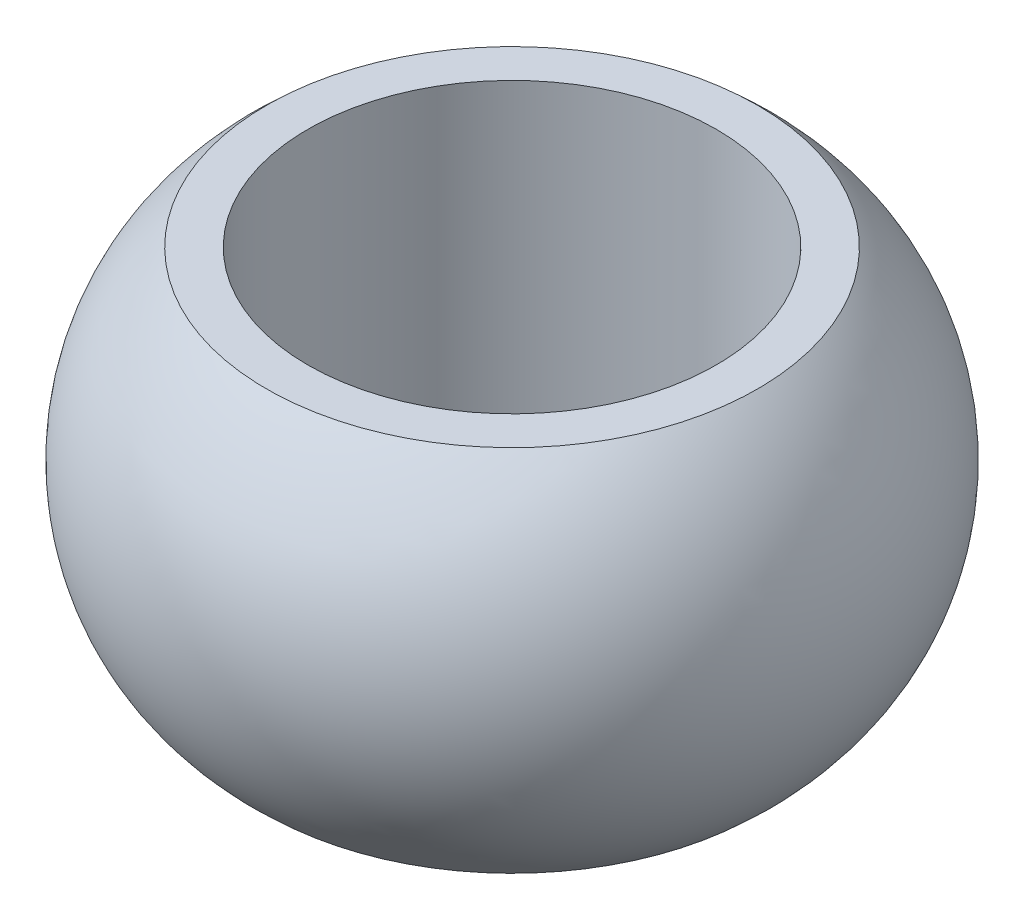
ISO-10303-21;
HEADER;
FILE_DESCRIPTION(('STEP AP214'),'2;1');
FILE_NAME('part.step','',(''),(''),'','','');
FILE_SCHEMA(('AUTOMOTIVE_DESIGN { 1 0 10303 214 1 1 1 1 }'));
ENDSEC;
DATA;
#1=APPLICATION_CONTEXT('core data for automotive mechanical design processes');
#2=APPLICATION_PROTOCOL_DEFINITION('international standard','automotive_design',2000,#1);
#3=PRODUCT_CONTEXT('',#1,'mechanical');
#4=PRODUCT('Part','Part','',(#3));
#5=PRODUCT_RELATED_PRODUCT_CATEGORY('part','',(#4));
#6=PRODUCT_DEFINITION_FORMATION('','',#4);
#7=PRODUCT_DEFINITION_CONTEXT('part definition',#1,'design');
#8=PRODUCT_DEFINITION('design','',#6,#7);
#9=PRODUCT_DEFINITION_SHAPE('','',#8);
#10=(LENGTH_UNIT() NAMED_UNIT(*) SI_UNIT(.MILLI.,.METRE.));
#11=(NAMED_UNIT(*) PLANE_ANGLE_UNIT() SI_UNIT($,.RADIAN.));
#12=(NAMED_UNIT(*) SI_UNIT($,.STERADIAN.) SOLID_ANGLE_UNIT());
#13=UNCERTAINTY_MEASURE_WITH_UNIT(LENGTH_MEASURE(1.E-05),#10,'distance_accuracy_value','');
#14=(GEOMETRIC_REPRESENTATION_CONTEXT(3) GLOBAL_UNCERTAINTY_ASSIGNED_CONTEXT((#13)) GLOBAL_UNIT_ASSIGNED_CONTEXT((#10,
#11,#12)) REPRESENTATION_CONTEXT('',''));
#15=CARTESIAN_POINT('',(0.,0.,0.));
#16=DIRECTION('',(0.,0.,1.));
#17=DIRECTION('',(1.,0.,0.));
#18=AXIS2_PLACEMENT_3D('',#15,#16,#17);
#19=CARTESIAN_POINT('',(4.93,-4.45,0.));
#20=DIRECTION('',(0.,-1.,0.));
#21=DIRECTION('',(0.,0.,-1.));
#22=AXIS2_PLACEMENT_3D('',#19,#20,#21);
#23=PLANE('',#22);
#24=CARTESIAN_POINT('',(0.,-4.45,0.));
#25=DIRECTION('',(0.,-1.,0.));
#26=DIRECTION('',(0.,0.,-1.));
#27=AXIS2_PLACEMENT_3D('',#24,#25,#26);
#28=CIRCLE('',#27,5.93);
#29=CARTESIAN_POINT('',(0.,-4.45,-5.93));
#30=VERTEX_POINT('',#29);
#31=EDGE_CURVE('E58',#30,#30,#28,.T.);
#32=ORIENTED_EDGE('',*,*,#31,.T.);
#33=EDGE_LOOP('',(#32));
#34=FACE_BOUND('',#33,.T.);
#35=CARTESIAN_POINT('',(0.,-4.45,0.));
#36=DIRECTION('',(0.,-1.,0.));
#37=DIRECTION('',(0.,0.,-1.));
#38=AXIS2_PLACEMENT_3D('',#35,#36,#37);
#39=CIRCLE('',#38,4.93);
#40=CARTESIAN_POINT('',(0.,-4.45,-4.93));
#41=VERTEX_POINT('',#40);
#42=EDGE_CURVE('E10',#41,#41,#39,.T.);
#43=ORIENTED_EDGE('',*,*,#42,.F.);
#44=EDGE_LOOP('',(#43));
#45=FACE_BOUND('',#44,.T.);
#46=ADVANCED_FACE('F41',(#34,#45),#23,.T.);
#47=CARTESIAN_POINT('',(0.,0.,0.));
#48=DIRECTION('',(0.,-1.,0.));
#49=DIRECTION('',(0.,0.,-1.));
#50=AXIS2_PLACEMENT_3D('',#47,#48,#49);
#51=CYLINDRICAL_SURFACE('',#50,4.93);
#52=ORIENTED_EDGE('',*,*,#42,.T.);
#53=EDGE_LOOP('',(#52));
#54=FACE_BOUND('',#53,.T.);
#55=CARTESIAN_POINT('',(0.,4.45,0.));
#56=DIRECTION('',(0.,-1.,0.));
#57=DIRECTION('',(0.,0.,-1.));
#58=AXIS2_PLACEMENT_3D('',#55,#56,#57);
#59=CIRCLE('',#58,4.93);
#60=CARTESIAN_POINT('',(0.,4.45,-4.93));
#61=VERTEX_POINT('',#60);
#62=EDGE_CURVE('E48',#61,#61,#59,.T.);
#63=ORIENTED_EDGE('',*,*,#62,.F.);
#64=EDGE_LOOP('',(#63));
#65=FACE_BOUND('',#64,.T.);
#66=ADVANCED_FACE('F75',(#54,#65),#51,.F.);
#67=CARTESIAN_POINT('',(4.93,4.45,0.));
#68=DIRECTION('',(0.,1.,0.));
#69=DIRECTION('',(0.,0.,1.));
#70=AXIS2_PLACEMENT_3D('',#67,#68,#69);
#71=PLANE('',#70);
#72=ORIENTED_EDGE('',*,*,#62,.T.);
#73=EDGE_LOOP('',(#72));
#74=FACE_BOUND('',#73,.T.);
#75=CARTESIAN_POINT('',(0.,4.45,0.));
#76=DIRECTION('',(0.,-1.,0.));
#77=DIRECTION('',(0.,0.,-1.));
#78=AXIS2_PLACEMENT_3D('',#75,#76,#77);
#79=CIRCLE('',#78,5.93);
#80=CARTESIAN_POINT('',(0.,4.45,-5.93));
#81=VERTEX_POINT('',#80);
#82=EDGE_CURVE('E53',#81,#81,#79,.T.);
#83=ORIENTED_EDGE('',*,*,#82,.F.);
#84=EDGE_LOOP('',(#83));
#85=FACE_BOUND('',#84,.T.);
#86=ADVANCED_FACE('F69',(#74,#85),#71,.T.);
#87=CARTESIAN_POINT('',(0.,0.,0.));
#88=DIRECTION('',(0.,-1.,0.));
#89=DIRECTION('',(0.,0.,-1.));
#90=AXIS2_PLACEMENT_3D('',#87,#88,#89);
#91=DEGENERATE_TOROIDAL_SURFACE('',#90,2.06753694581281,5.89246305418719,.T.);
#92=ORIENTED_EDGE('',*,*,#82,.T.);
#93=EDGE_LOOP('',(#92));
#94=FACE_BOUND('',#93,.T.);
#95=ORIENTED_EDGE('',*,*,#31,.F.);
#96=EDGE_LOOP('',(#95));
#97=FACE_BOUND('',#96,.T.);
#98=ADVANCED_FACE('F67',(#94,#97),#91,.T.);
#99=CLOSED_SHELL('',(#46,#66,#86,#98));
#100=MANIFOLD_SOLID_BREP('B2',#99);
#101=ADVANCED_BREP_SHAPE_REPRESENTATION('',(#18,#100),#14);
#102=SHAPE_DEFINITION_REPRESENTATION(#9,#101);
ENDSEC;
END-ISO-10303-21;
